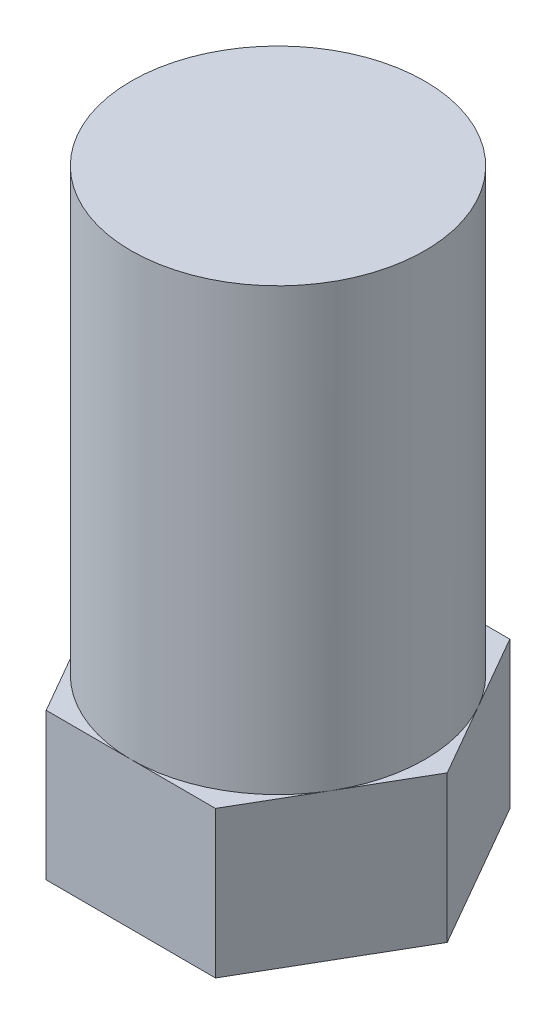
ISO-10303-21;
HEADER;
FILE_DESCRIPTION(('STEP AP214'),'2;1');
FILE_NAME('part.step','',(''),(''),'','','');
FILE_SCHEMA(('AUTOMOTIVE_DESIGN { 1 0 10303 214 1 1 1 1 }'));
ENDSEC;
DATA;
#1=APPLICATION_CONTEXT('core data for automotive mechanical design processes');
#2=APPLICATION_PROTOCOL_DEFINITION('international standard','automotive_design',2000,#1);
#3=PRODUCT_CONTEXT('',#1,'mechanical');
#4=PRODUCT('Part','Part','',(#3));
#5=PRODUCT_RELATED_PRODUCT_CATEGORY('part','',(#4));
#6=PRODUCT_DEFINITION_FORMATION('','',#4);
#7=PRODUCT_DEFINITION_CONTEXT('part definition',#1,'design');
#8=PRODUCT_DEFINITION('design','',#6,#7);
#9=PRODUCT_DEFINITION_SHAPE('','',#8);
#10=(LENGTH_UNIT() NAMED_UNIT(*) SI_UNIT(.MILLI.,.METRE.));
#11=(NAMED_UNIT(*) PLANE_ANGLE_UNIT() SI_UNIT($,.RADIAN.));
#12=(NAMED_UNIT(*) SI_UNIT($,.STERADIAN.) SOLID_ANGLE_UNIT());
#13=UNCERTAINTY_MEASURE_WITH_UNIT(LENGTH_MEASURE(1.E-05),#10,'distance_accuracy_value','');
#14=(GEOMETRIC_REPRESENTATION_CONTEXT(3) GLOBAL_UNCERTAINTY_ASSIGNED_CONTEXT((#13)) GLOBAL_UNIT_ASSIGNED_CONTEXT((#10,
#11,#12)) REPRESENTATION_CONTEXT('',''));
#15=CARTESIAN_POINT('',(0.,0.,0.));
#16=DIRECTION('',(0.,0.,1.));
#17=DIRECTION('',(1.,0.,0.));
#18=AXIS2_PLACEMENT_3D('',#15,#16,#17);
#19=CARTESIAN_POINT('',(0.,5.,0.));
#20=DIRECTION('',(0.,1.,0.));
#21=DIRECTION('',(0.,0.,1.));
#22=AXIS2_PLACEMENT_3D('',#19,#20,#21);
#23=PLANE('',#22);
#24=CARTESIAN_POINT('',(0.,5.,0.));
#25=DIRECTION('',(0.,1.,0.));
#26=DIRECTION('',(0.,0.,1.));
#27=AXIS2_PLACEMENT_3D('',#24,#25,#26);
#28=CIRCLE('',#27,5.);
#29=CARTESIAN_POINT('',(4.32495321294975,5.,2.50893995659434));
#30=VERTEX_POINT('',#29);
#31=CARTESIAN_POINT('',(4.3352823454554,5.,-2.49104937429645));
#32=VERTEX_POINT('',#31);
#33=EDGE_CURVE('E44',#30,#32,#28,.T.);
#34=ORIENTED_EDGE('',*,*,#33,.F.);
#35=DIRECTION('',(0.501787991318868,0.,-0.864990642589951));
#36=VECTOR('',#35,1.);
#37=CARTESIAN_POINT('',(2.8764160536294,5.,5.00595285832342));
#38=LINE('',#37,#36);
#39=CARTESIAN_POINT('',(5.7734903722701,5.,0.0119270548652635));
#40=VERTEX_POINT('',#39);
#41=EDGE_CURVE('E114',#30,#40,#38,.T.);
#42=ORIENTED_EDGE('',*,*,#41,.T.);
#43=DIRECTION('',(-0.498209874859289,0.,-0.86705646909108));
#44=VECTOR('',#43,1.);
#45=CARTESIAN_POINT('',(5.7734903722701,5.,0.0119270548652635));
#46=LINE('',#45,#44);
#47=EDGE_CURVE('E125',#40,#32,#46,.T.);
#48=ORIENTED_EDGE('',*,*,#47,.T.);
#49=EDGE_LOOP('',(#34,#42,#48));
#50=FACE_BOUND('',#49,.T.);
#51=ADVANCED_FACE('F33',(#50),#23,.T.);
#52=CARTESIAN_POINT('',(0.010329132505649,5.,-4.99998933089079));
#53=VERTEX_POINT('',#52);
#54=EDGE_CURVE('E11',#32,#53,#28,.T.);
#55=ORIENTED_EDGE('',*,*,#54,.F.);
#56=CARTESIAN_POINT('',(2.8970743186407,5.,-4.99402580345815));
#57=VERTEX_POINT('',#56);
#58=EDGE_CURVE('E137',#32,#57,#46,.T.);
#59=ORIENTED_EDGE('',*,*,#58,.T.);
#60=DIRECTION('',(-0.999997866178157,0.,-0.00206582650112979));
#61=VECTOR('',#60,1.);
#62=CARTESIAN_POINT('',(2.8970743186407,5.,-4.99402580345815));
#63=LINE('',#62,#61);
#64=EDGE_CURVE('E138',#57,#53,#63,.T.);
#65=ORIENTED_EDGE('',*,*,#64,.T.);
#66=EDGE_LOOP('',(#55,#59,#65));
#67=FACE_BOUND('',#66,.T.);
#68=ADVANCED_FACE('F204',(#67),#23,.T.);
#69=CARTESIAN_POINT('',(-4.32495321294975,5.,-2.50893995659434));
#70=VERTEX_POINT('',#69);
#71=EDGE_CURVE('E42',#53,#70,#28,.T.);
#72=ORIENTED_EDGE('',*,*,#71,.F.);
#73=CARTESIAN_POINT('',(-2.8764160536294,5.,-5.00595285832342));
#74=VERTEX_POINT('',#73);
#75=EDGE_CURVE('E136',#53,#74,#63,.T.);
#76=ORIENTED_EDGE('',*,*,#75,.T.);
#77=DIRECTION('',(-0.501787991318868,0.,0.864990642589951));
#78=VECTOR('',#77,1.);
#79=CARTESIAN_POINT('',(-2.8764160536294,5.,-5.00595285832342));
#80=LINE('',#79,#78);
#81=EDGE_CURVE('E142',#74,#70,#80,.T.);
#82=ORIENTED_EDGE('',*,*,#81,.T.);
#83=EDGE_LOOP('',(#72,#76,#82));
#84=FACE_BOUND('',#83,.T.);
#85=ADVANCED_FACE('F199',(#84),#23,.T.);
#86=CARTESIAN_POINT('',(-4.3352823454554,5.,2.49104937429645));
#87=VERTEX_POINT('',#86);
#88=EDGE_CURVE('E130',#70,#87,#28,.T.);
#89=ORIENTED_EDGE('',*,*,#88,.F.);
#90=CARTESIAN_POINT('',(-5.7734903722701,5.,-0.0119270548652613));
#91=VERTEX_POINT('',#90);
#92=EDGE_CURVE('E141',#70,#91,#80,.T.);
#93=ORIENTED_EDGE('',*,*,#92,.T.);
#94=DIRECTION('',(0.498209874859289,0.,0.86705646909108));
#95=VECTOR('',#94,1.);
#96=CARTESIAN_POINT('',(-5.7734903722701,5.,-0.0119270548652613));
#97=LINE('',#96,#95);
#98=EDGE_CURVE('E146',#91,#87,#97,.T.);
#99=ORIENTED_EDGE('',*,*,#98,.T.);
#100=EDGE_LOOP('',(#89,#93,#99));
#101=FACE_BOUND('',#100,.T.);
#102=ADVANCED_FACE('F196',(#101),#23,.T.);
#103=CARTESIAN_POINT('',(-0.010329132505649,5.,4.99998933089079));
#104=VERTEX_POINT('',#103);
#105=EDGE_CURVE('E59',#87,#104,#28,.T.);
#106=ORIENTED_EDGE('',*,*,#105,.F.);
#107=CARTESIAN_POINT('',(-2.8970743186407,5.,4.99402580345815));
#108=VERTEX_POINT('',#107);
#109=EDGE_CURVE('E145',#87,#108,#97,.T.);
#110=ORIENTED_EDGE('',*,*,#109,.T.);
#111=DIRECTION('',(0.999997866178157,0.,0.00206582650112979));
#112=VECTOR('',#111,1.);
#113=CARTESIAN_POINT('',(-2.8970743186407,5.,4.99402580345815));
#114=LINE('',#113,#112);
#115=EDGE_CURVE('E123',#108,#104,#114,.T.);
#116=ORIENTED_EDGE('',*,*,#115,.T.);
#117=EDGE_LOOP('',(#106,#110,#116));
#118=FACE_BOUND('',#117,.T.);
#119=ADVANCED_FACE('F194',(#118),#23,.T.);
#120=CARTESIAN_POINT('',(5.7734903722701,5.,0.0119270548652635));
#121=DIRECTION('',(-0.86705646909108,0.,0.498209874859289));
#122=DIRECTION('',(0.498209874859289,0.,0.86705646909108));
#123=AXIS2_PLACEMENT_3D('',#120,#121,#122);
#124=PLANE('',#123);
#125=DIRECTION('',(-0.498209874859289,0.,-0.86705646909108));
#126=VECTOR('',#125,1.);
#127=CARTESIAN_POINT('',(5.7734903722701,0.,0.0119270548652635));
#128=LINE('',#127,#126);
#129=CARTESIAN_POINT('',(5.7734903722701,0.,0.0119270548652635));
#130=VERTEX_POINT('',#129);
#131=CARTESIAN_POINT('',(2.8970743186407,0.,-4.99402580345815));
#132=VERTEX_POINT('',#131);
#133=EDGE_CURVE('E150',#130,#132,#128,.T.);
#134=ORIENTED_EDGE('',*,*,#133,.T.);
#135=DIRECTION('',(0.,-1.,0.));
#136=VECTOR('',#135,1.);
#137=CARTESIAN_POINT('',(2.8970743186407,5.,-4.99402580345815));
#138=LINE('',#137,#136);
#139=EDGE_CURVE('E37',#57,#132,#138,.T.);
#140=ORIENTED_EDGE('',*,*,#139,.F.);
#141=ORIENTED_EDGE('',*,*,#58,.F.);
#142=ORIENTED_EDGE('',*,*,#47,.F.);
#143=DIRECTION('',(0.,-1.,0.));
#144=VECTOR('',#143,1.);
#145=CARTESIAN_POINT('',(5.7734903722701,5.,0.0119270548652635));
#146=LINE('',#145,#144);
#147=EDGE_CURVE('E113',#40,#130,#146,.T.);
#148=ORIENTED_EDGE('',*,*,#147,.T.);
#149=EDGE_LOOP('',(#134,#140,#141,#142,#148));
#150=FACE_BOUND('',#149,.T.);
#151=ADVANCED_FACE('F35',(#150),#124,.F.);
#152=CARTESIAN_POINT('',(2.8970743186407,5.,-4.99402580345815));
#153=DIRECTION('',(-0.00206582650112979,0.,0.999997866178157));
#154=DIRECTION('',(0.999997866178157,0.,0.00206582650112979));
#155=AXIS2_PLACEMENT_3D('',#152,#153,#154);
#156=PLANE('',#155);
#157=DIRECTION('',(-0.999997866178157,0.,-0.00206582650112979));
#158=VECTOR('',#157,1.);
#159=CARTESIAN_POINT('',(2.8970743186407,0.,-4.99402580345815));
#160=LINE('',#159,#158);
#161=CARTESIAN_POINT('',(-2.8764160536294,0.,-5.00595285832342));
#162=VERTEX_POINT('',#161);
#163=EDGE_CURVE('E153',#132,#162,#160,.T.);
#164=ORIENTED_EDGE('',*,*,#163,.T.);
#165=DIRECTION('',(0.,-1.,0.));
#166=VECTOR('',#165,1.);
#167=CARTESIAN_POINT('',(-2.8764160536294,5.,-5.00595285832342));
#168=LINE('',#167,#166);
#169=EDGE_CURVE('E132',#74,#162,#168,.T.);
#170=ORIENTED_EDGE('',*,*,#169,.F.);
#171=ORIENTED_EDGE('',*,*,#75,.F.);
#172=ORIENTED_EDGE('',*,*,#64,.F.);
#173=ORIENTED_EDGE('',*,*,#139,.T.);
#174=EDGE_LOOP('',(#164,#170,#171,#172,#173));
#175=FACE_BOUND('',#174,.T.);
#176=ADVANCED_FACE('F201',(#175),#156,.F.);
#177=CARTESIAN_POINT('',(-2.8764160536294,5.,-5.00595285832342));
#178=DIRECTION('',(0.864990642589951,0.,0.501787991318868));
#179=DIRECTION('',(0.501787991318868,0.,-0.864990642589951));
#180=AXIS2_PLACEMENT_3D('',#177,#178,#179);
#181=PLANE('',#180);
#182=DIRECTION('',(-0.501787991318868,0.,0.864990642589951));
#183=VECTOR('',#182,1.);
#184=CARTESIAN_POINT('',(-2.8764160536294,0.,-5.00595285832342));
#185=LINE('',#184,#183);
#186=CARTESIAN_POINT('',(-5.7734903722701,0.,-0.0119270548652613));
#187=VERTEX_POINT('',#186);
#188=EDGE_CURVE('E155',#162,#187,#185,.T.);
#189=ORIENTED_EDGE('',*,*,#188,.T.);
#190=DIRECTION('',(0.,-1.,0.));
#191=VECTOR('',#190,1.);
#192=CARTESIAN_POINT('',(-5.7734903722701,5.,-0.0119270548652613));
#193=LINE('',#192,#191);
#194=EDGE_CURVE('E169',#91,#187,#193,.T.);
#195=ORIENTED_EDGE('',*,*,#194,.F.);
#196=ORIENTED_EDGE('',*,*,#92,.F.);
#197=ORIENTED_EDGE('',*,*,#81,.F.);
#198=ORIENTED_EDGE('',*,*,#169,.T.);
#199=EDGE_LOOP('',(#189,#195,#196,#197,#198));
#200=FACE_BOUND('',#199,.T.);
#201=ADVANCED_FACE('F176',(#200),#181,.F.);
#202=CARTESIAN_POINT('',(-5.7734903722701,5.,-0.0119270548652613));
#203=DIRECTION('',(0.86705646909108,0.,-0.498209874859289));
#204=DIRECTION('',(-0.498209874859289,0.,-0.86705646909108));
#205=AXIS2_PLACEMENT_3D('',#202,#203,#204);
#206=PLANE('',#205);
#207=DIRECTION('',(0.498209874859289,0.,0.86705646909108));
#208=VECTOR('',#207,1.);
#209=CARTESIAN_POINT('',(-5.7734903722701,0.,-0.0119270548652613));
#210=LINE('',#209,#208);
#211=CARTESIAN_POINT('',(-2.8970743186407,0.,4.99402580345815));
#212=VERTEX_POINT('',#211);
#213=EDGE_CURVE('E157',#187,#212,#210,.T.);
#214=ORIENTED_EDGE('',*,*,#213,.T.);
#215=DIRECTION('',(0.,-1.,0.));
#216=VECTOR('',#215,1.);
#217=CARTESIAN_POINT('',(-2.8970743186407,5.,4.99402580345815));
#218=LINE('',#217,#216);
#219=EDGE_CURVE('E166',#108,#212,#218,.T.);
#220=ORIENTED_EDGE('',*,*,#219,.F.);
#221=ORIENTED_EDGE('',*,*,#109,.F.);
#222=ORIENTED_EDGE('',*,*,#98,.F.);
#223=ORIENTED_EDGE('',*,*,#194,.T.);
#224=EDGE_LOOP('',(#214,#220,#221,#222,#223));
#225=FACE_BOUND('',#224,.T.);
#226=ADVANCED_FACE('F189',(#225),#206,.F.);
#227=CARTESIAN_POINT('',(-2.8970743186407,5.,4.99402580345815));
#228=DIRECTION('',(0.00206582650112979,0.,-0.999997866178157));
#229=DIRECTION('',(-0.999997866178157,0.,-0.00206582650112979));
#230=AXIS2_PLACEMENT_3D('',#227,#228,#229);
#231=PLANE('',#230);
#232=DIRECTION('',(0.999997866178157,0.,0.00206582650112979));
#233=VECTOR('',#232,1.);
#234=CARTESIAN_POINT('',(-2.8970743186407,0.,4.99402580345815));
#235=LINE('',#234,#233);
#236=CARTESIAN_POINT('',(2.8764160536294,0.,5.00595285832342));
#237=VERTEX_POINT('',#236);
#238=EDGE_CURVE('E159',#212,#237,#235,.T.);
#239=ORIENTED_EDGE('',*,*,#238,.T.);
#240=DIRECTION('',(0.,-1.,0.));
#241=VECTOR('',#240,1.);
#242=CARTESIAN_POINT('',(2.8764160536294,5.,5.00595285832342));
#243=LINE('',#242,#241);
#244=CARTESIAN_POINT('',(2.8764160536294,5.,5.00595285832342));
#245=VERTEX_POINT('',#244);
#246=EDGE_CURVE('E164',#245,#237,#243,.T.);
#247=ORIENTED_EDGE('',*,*,#246,.F.);
#248=EDGE_CURVE('E109',#104,#245,#114,.T.);
#249=ORIENTED_EDGE('',*,*,#248,.F.);
#250=ORIENTED_EDGE('',*,*,#115,.F.);
#251=ORIENTED_EDGE('',*,*,#219,.T.);
#252=EDGE_LOOP('',(#239,#247,#249,#250,#251));
#253=FACE_BOUND('',#252,.T.);
#254=ADVANCED_FACE('F193',(#253),#231,.F.);
#255=CARTESIAN_POINT('',(2.8764160536294,5.,5.00595285832342));
#256=DIRECTION('',(-0.864990642589951,0.,-0.501787991318868));
#257=DIRECTION('',(-0.501787991318868,0.,0.864990642589951));
#258=AXIS2_PLACEMENT_3D('',#255,#256,#257);
#259=PLANE('',#258);
#260=DIRECTION('',(0.501787991318868,0.,-0.864990642589951));
#261=VECTOR('',#260,1.);
#262=CARTESIAN_POINT('',(2.8764160536294,0.,5.00595285832342));
#263=LINE('',#262,#261);
#264=EDGE_CURVE('E161',#237,#130,#263,.T.);
#265=ORIENTED_EDGE('',*,*,#264,.T.);
#266=ORIENTED_EDGE('',*,*,#147,.F.);
#267=ORIENTED_EDGE('',*,*,#41,.F.);
#268=EDGE_CURVE('E106',#245,#30,#38,.T.);
#269=ORIENTED_EDGE('',*,*,#268,.F.);
#270=ORIENTED_EDGE('',*,*,#246,.T.);
#271=EDGE_LOOP('',(#265,#266,#267,#269,#270));
#272=FACE_BOUND('',#271,.T.);
#273=ADVANCED_FACE('F118',(#272),#259,.F.);
#274=EDGE_CURVE('E51',#104,#30,#28,.T.);
#275=ORIENTED_EDGE('',*,*,#274,.F.);
#276=ORIENTED_EDGE('',*,*,#248,.T.);
#277=ORIENTED_EDGE('',*,*,#268,.T.);
#278=EDGE_LOOP('',(#275,#276,#277));
#279=FACE_BOUND('',#278,.T.);
#280=ADVANCED_FACE('F108',(#279),#23,.T.);
#281=CARTESIAN_POINT('',(0.,0.,0.));
#282=DIRECTION('',(0.,1.,0.));
#283=DIRECTION('',(0.,0.,1.));
#284=AXIS2_PLACEMENT_3D('',#281,#282,#283);
#285=PLANE('',#284);
#286=ORIENTED_EDGE('',*,*,#133,.F.);
#287=ORIENTED_EDGE('',*,*,#264,.F.);
#288=ORIENTED_EDGE('',*,*,#238,.F.);
#289=ORIENTED_EDGE('',*,*,#213,.F.);
#290=ORIENTED_EDGE('',*,*,#188,.F.);
#291=ORIENTED_EDGE('',*,*,#163,.F.);
#292=EDGE_LOOP('',(#286,#287,#288,#289,#290,#291));
#293=FACE_BOUND('',#292,.T.);
#294=ADVANCED_FACE('F184',(#293),#285,.F.);
#295=CARTESIAN_POINT('',(0.,20.,0.));
#296=DIRECTION('',(0.,-1.,0.));
#297=DIRECTION('',(0.,0.,-1.));
#298=AXIS2_PLACEMENT_3D('',#295,#296,#297);
#299=CYLINDRICAL_SURFACE('',#298,5.);
#300=CARTESIAN_POINT('',(0.,20.,0.));
#301=DIRECTION('',(0.,1.,0.));
#302=DIRECTION('',(0.,0.,1.));
#303=AXIS2_PLACEMENT_3D('',#300,#301,#302);
#304=CIRCLE('',#303,5.);
#305=CARTESIAN_POINT('',(0.,20.,5.));
#306=VERTEX_POINT('',#305);
#307=EDGE_CURVE('E127',#306,#306,#304,.T.);
#308=ORIENTED_EDGE('',*,*,#307,.F.);
#309=EDGE_LOOP('',(#308));
#310=FACE_BOUND('',#309,.T.);
#311=ORIENTED_EDGE('',*,*,#33,.T.);
#312=ORIENTED_EDGE('',*,*,#54,.T.);
#313=ORIENTED_EDGE('',*,*,#71,.T.);
#314=ORIENTED_EDGE('',*,*,#88,.T.);
#315=ORIENTED_EDGE('',*,*,#105,.T.);
#316=ORIENTED_EDGE('',*,*,#274,.T.);
#317=EDGE_LOOP('',(#311,#312,#313,#314,#315,#316));
#318=FACE_BOUND('',#317,.T.);
#319=ADVANCED_FACE('F128',(#310,#318),#299,.T.);
#320=CARTESIAN_POINT('',(0.,20.,0.));
#321=DIRECTION('',(0.,1.,0.));
#322=DIRECTION('',(0.,0.,1.));
#323=AXIS2_PLACEMENT_3D('',#320,#321,#322);
#324=PLANE('',#323);
#325=ORIENTED_EDGE('',*,*,#307,.T.);
#326=EDGE_LOOP('',(#325));
#327=FACE_BOUND('',#326,.T.);
#328=ADVANCED_FACE('F263',(#327),#324,.T.);
#329=CLOSED_SHELL('',(#51,#68,#85,#102,#119,#151,#176,#201,#226,#254,#273,#280,#294,#319,#328));
#330=MANIFOLD_SOLID_BREP('B2',#329);
#331=ADVANCED_BREP_SHAPE_REPRESENTATION('',(#18,#330),#14);
#332=SHAPE_DEFINITION_REPRESENTATION(#9,#331);
ENDSEC;
END-ISO-10303-21;
